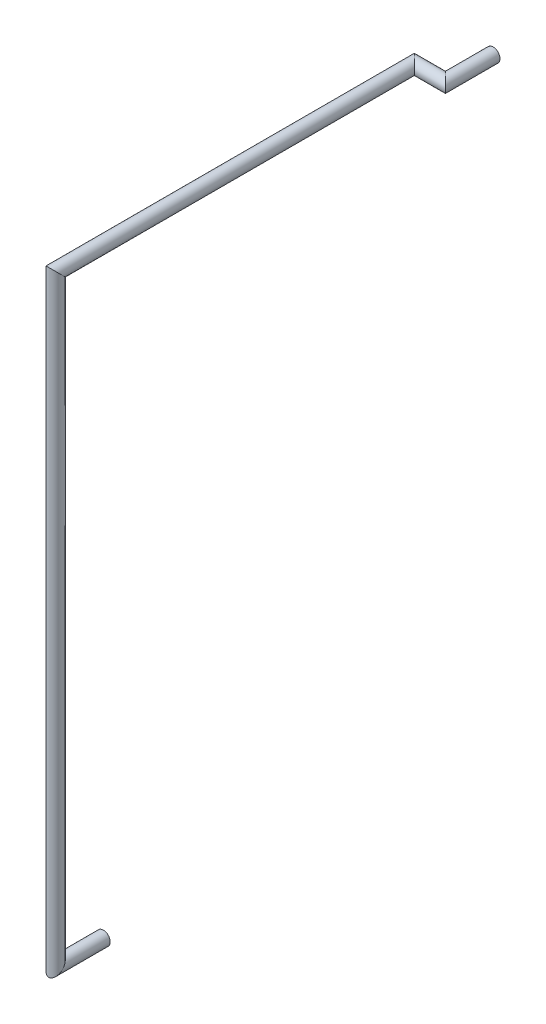
ISO-10303-21;
HEADER;
FILE_DESCRIPTION(('STEP AP214'),'2;1');
FILE_NAME('part.step','',(''),(''),'','','');
FILE_SCHEMA(('AUTOMOTIVE_DESIGN { 1 0 10303 214 1 1 1 1 }'));
ENDSEC;
DATA;
#1=APPLICATION_CONTEXT('core data for automotive mechanical design processes');
#2=APPLICATION_PROTOCOL_DEFINITION('international standard','automotive_design',2000,#1);
#3=PRODUCT_CONTEXT('',#1,'mechanical');
#4=PRODUCT('Part','Part','',(#3));
#5=PRODUCT_RELATED_PRODUCT_CATEGORY('part','',(#4));
#6=PRODUCT_DEFINITION_FORMATION('','',#4);
#7=PRODUCT_DEFINITION_CONTEXT('part definition',#1,'design');
#8=PRODUCT_DEFINITION('design','',#6,#7);
#9=PRODUCT_DEFINITION_SHAPE('','',#8);
#10=(LENGTH_UNIT() NAMED_UNIT(*) SI_UNIT(.MILLI.,.METRE.));
#11=(NAMED_UNIT(*) PLANE_ANGLE_UNIT() SI_UNIT($,.RADIAN.));
#12=(NAMED_UNIT(*) SI_UNIT($,.STERADIAN.) SOLID_ANGLE_UNIT());
#13=UNCERTAINTY_MEASURE_WITH_UNIT(LENGTH_MEASURE(1.E-05),#10,'distance_accuracy_value','');
#14=(GEOMETRIC_REPRESENTATION_CONTEXT(3) GLOBAL_UNCERTAINTY_ASSIGNED_CONTEXT((#13)) GLOBAL_UNIT_ASSIGNED_CONTEXT((#10,
#11,#12)) REPRESENTATION_CONTEXT('',''));
#15=CARTESIAN_POINT('',(0.,0.,0.));
#16=DIRECTION('',(0.,0.,1.));
#17=DIRECTION('',(1.,0.,0.));
#18=AXIS2_PLACEMENT_3D('',#15,#16,#17);
#19=CARTESIAN_POINT('',(2.28,44.06,-26.29));
#20=DIRECTION('',(0.,0.,-1.));
#21=DIRECTION('',(1.,0.,0.));
#22=AXIS2_PLACEMENT_3D('',#19,#20,#21);
#23=PLANE('',#22);
#24=CARTESIAN_POINT('',(2.28,44.06,-26.29));
#25=DIRECTION('',(0.,0.,-1.));
#26=DIRECTION('',(1.,0.,0.));
#27=AXIS2_PLACEMENT_3D('',#24,#25,#26);
#28=CIRCLE('',#27,0.5);
#29=CARTESIAN_POINT('',(2.78,44.06,-26.29));
#30=VERTEX_POINT('',#29);
#31=EDGE_CURVE('E44',#30,#30,#28,.T.);
#32=ORIENTED_EDGE('',*,*,#31,.T.);
#33=EDGE_LOOP('',(#32));
#34=FACE_BOUND('',#33,.T.);
#35=ADVANCED_FACE('F41',(#34),#23,.T.);
#36=CARTESIAN_POINT('',(0.,0.,0.));
#37=DIRECTION('',(0.,0.,1.));
#38=DIRECTION('',(1.,0.,0.));
#39=AXIS2_PLACEMENT_3D('',#36,#37,#38);
#40=PLANE('',#39);
#41=CARTESIAN_POINT('',(0.,0.,0.));
#42=DIRECTION('',(0.,0.,1.));
#43=DIRECTION('',(1.,0.,0.));
#44=AXIS2_PLACEMENT_3D('',#41,#42,#43);
#45=CIRCLE('',#44,0.5);
#46=CARTESIAN_POINT('',(0.5,0.,0.));
#47=VERTEX_POINT('',#46);
#48=EDGE_CURVE('E48',#47,#47,#45,.T.);
#49=ORIENTED_EDGE('',*,*,#48,.F.);
#50=EDGE_LOOP('',(#49));
#51=FACE_BOUND('',#50,.T.);
#52=ADVANCED_FACE('F71',(#51),#40,.F.);
#53=CARTESIAN_POINT('',(2.28,44.06,-22.14));
#54=DIRECTION('',(0.,0.,-1.));
#55=DIRECTION('',(-1.,0.,0.));
#56=AXIS2_PLACEMENT_3D('',#53,#54,#55);
#57=CYLINDRICAL_SURFACE('',#56,0.5);
#58=CARTESIAN_POINT('',(2.28,44.06,-22.79));
#59=DIRECTION('',(0.707106781186547,0.,-0.707106781186547));
#60=DIRECTION('',(0.707106781186548,0.,0.707106781186548));
#61=AXIS2_PLACEMENT_3D('',#58,#59,#60);
#62=ELLIPSE('',#61,0.707106781186548,0.5);
#63=CARTESIAN_POINT('',(2.78,44.06,-22.29));
#64=VERTEX_POINT('',#63);
#65=EDGE_CURVE('E60',#64,#64,#62,.F.);
#66=ORIENTED_EDGE('',*,*,#65,.F.);
#67=EDGE_LOOP('',(#66));
#68=FACE_BOUND('',#67,.T.);
#69=ORIENTED_EDGE('',*,*,#31,.F.);
#70=EDGE_LOOP('',(#69));
#71=FACE_BOUND('',#70,.T.);
#72=ADVANCED_FACE('F68',(#68,#71),#57,.T.);
#73=CARTESIAN_POINT('',(-0.649999999999996,44.06,-22.79));
#74=DIRECTION('',(1.,0.,0.));
#75=DIRECTION('',(0.,0.,-1.));
#76=AXIS2_PLACEMENT_3D('',#73,#74,#75);
#77=CYLINDRICAL_SURFACE('',#76,0.5);
#78=CARTESIAN_POINT('',(0.,44.06,-22.79));
#79=DIRECTION('',(0.707106781186548,0.,-0.707106781186548));
#80=DIRECTION('',(-0.707106781186548,0.,-0.707106781186548));
#81=AXIS2_PLACEMENT_3D('',#78,#79,#80);
#82=ELLIPSE('',#81,0.707106781186547,0.5);
#83=CARTESIAN_POINT('',(-0.5,44.06,-23.29));
#84=VERTEX_POINT('',#83);
#85=EDGE_CURVE('E58',#84,#84,#82,.F.);
#86=ORIENTED_EDGE('',*,*,#85,.F.);
#87=EDGE_LOOP('',(#86));
#88=FACE_BOUND('',#87,.T.);
#89=ORIENTED_EDGE('',*,*,#65,.T.);
#90=EDGE_LOOP('',(#89));
#91=FACE_BOUND('',#90,.T.);
#92=ADVANCED_FACE('F70',(#88,#91),#77,.T.);
#93=CARTESIAN_POINT('',(0.,44.06,4.69999999999999));
#94=DIRECTION('',(0.,0.,-1.));
#95=DIRECTION('',(-1.,0.,0.));
#96=AXIS2_PLACEMENT_3D('',#93,#94,#95);
#97=CYLINDRICAL_SURFACE('',#96,0.5);
#98=CARTESIAN_POINT('',(0.,44.06,3.5));
#99=DIRECTION('',(0.,0.707106781186548,-0.707106781186548));
#100=DIRECTION('',(0.,0.707106781186548,0.707106781186548));
#101=AXIS2_PLACEMENT_3D('',#98,#99,#100);
#102=ELLIPSE('',#101,0.707106781186547,0.5);
#103=CARTESIAN_POINT('',(0.,44.56,4.));
#104=VERTEX_POINT('',#103);
#105=EDGE_CURVE('E53',#104,#104,#102,.F.);
#106=ORIENTED_EDGE('',*,*,#105,.F.);
#107=EDGE_LOOP('',(#106));
#108=FACE_BOUND('',#107,.T.);
#109=ORIENTED_EDGE('',*,*,#85,.T.);
#110=EDGE_LOOP('',(#109));
#111=FACE_BOUND('',#110,.T.);
#112=ADVANCED_FACE('F78',(#108,#111),#97,.T.);
#113=CARTESIAN_POINT('',(0.,-1.2,3.5));
#114=DIRECTION('',(0.,1.,0.));
#115=DIRECTION('',(0.,0.,1.));
#116=AXIS2_PLACEMENT_3D('',#113,#114,#115);
#117=CYLINDRICAL_SURFACE('',#116,0.5);
#118=CARTESIAN_POINT('',(0.,0.,3.5));
#119=DIRECTION('',(0.,0.707106781186547,0.707106781186547));
#120=DIRECTION('',(0.,-0.707106781186548,0.707106781186548));
#121=AXIS2_PLACEMENT_3D('',#118,#119,#120);
#122=ELLIPSE('',#121,0.707106781186548,0.5);
#123=CARTESIAN_POINT('',(0.,-0.5,4.));
#124=VERTEX_POINT('',#123);
#125=EDGE_CURVE('E10',#124,#124,#122,.F.);
#126=ORIENTED_EDGE('',*,*,#125,.F.);
#127=EDGE_LOOP('',(#126));
#128=FACE_BOUND('',#127,.T.);
#129=ORIENTED_EDGE('',*,*,#105,.T.);
#130=EDGE_LOOP('',(#129));
#131=FACE_BOUND('',#130,.T.);
#132=ADVANCED_FACE('F84',(#128,#131),#117,.T.);
#133=CARTESIAN_POINT('',(0.,0.,0.));
#134=DIRECTION('',(0.,0.,1.));
#135=DIRECTION('',(1.,0.,0.));
#136=AXIS2_PLACEMENT_3D('',#133,#134,#135);
#137=CYLINDRICAL_SURFACE('',#136,0.5);
#138=ORIENTED_EDGE('',*,*,#48,.T.);
#139=EDGE_LOOP('',(#138));
#140=FACE_BOUND('',#139,.T.);
#141=ORIENTED_EDGE('',*,*,#125,.T.);
#142=EDGE_LOOP('',(#141));
#143=FACE_BOUND('',#142,.T.);
#144=ADVANCED_FACE('F82',(#140,#143),#137,.T.);
#145=CLOSED_SHELL('',(#35,#52,#72,#92,#112,#132,#144));
#146=MANIFOLD_SOLID_BREP('B2',#145);
#147=ADVANCED_BREP_SHAPE_REPRESENTATION('',(#18,#146),#14);
#148=SHAPE_DEFINITION_REPRESENTATION(#9,#147);
ENDSEC;
END-ISO-10303-21;
